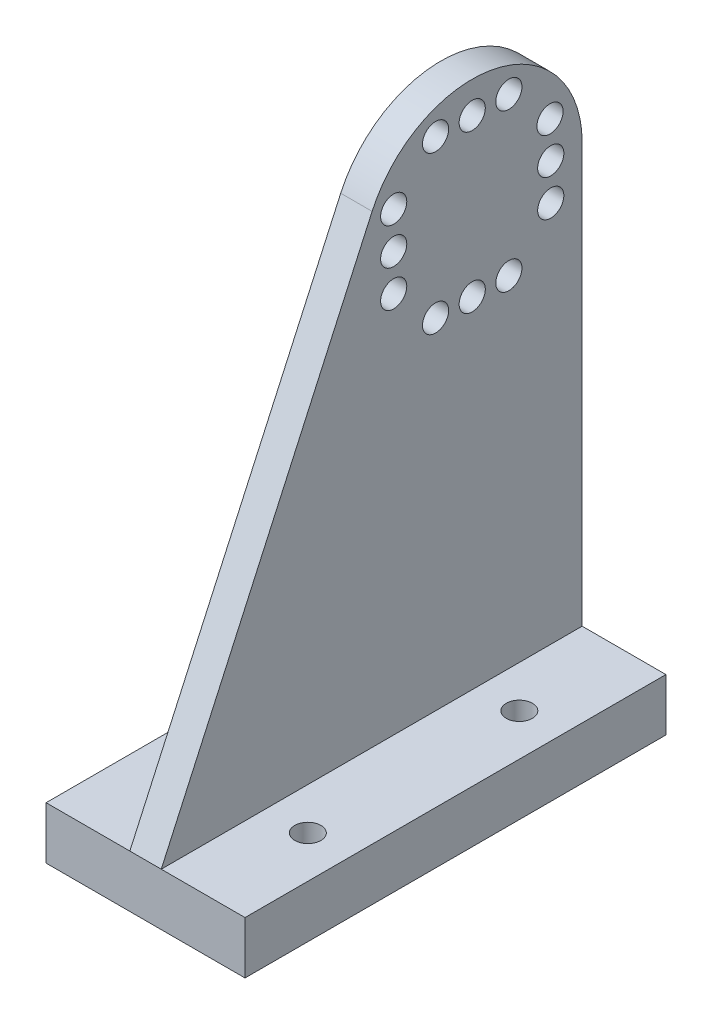
ISO-10303-21;
HEADER;
FILE_DESCRIPTION(('STEP AP214'),'2;1');
FILE_NAME('part.step','',(''),(''),'','','');
FILE_SCHEMA(('AUTOMOTIVE_DESIGN { 1 0 10303 214 1 1 1 1 }'));
ENDSEC;
DATA;
#1=APPLICATION_CONTEXT('core data for automotive mechanical design processes');
#2=APPLICATION_PROTOCOL_DEFINITION('international standard','automotive_design',2000,#1);
#3=PRODUCT_CONTEXT('',#1,'mechanical');
#4=PRODUCT('Part','Part','',(#3));
#5=PRODUCT_RELATED_PRODUCT_CATEGORY('part','',(#4));
#6=PRODUCT_DEFINITION_FORMATION('','',#4);
#7=PRODUCT_DEFINITION_CONTEXT('part definition',#1,'design');
#8=PRODUCT_DEFINITION('design','',#6,#7);
#9=PRODUCT_DEFINITION_SHAPE('','',#8);
#10=(LENGTH_UNIT() NAMED_UNIT(*) SI_UNIT(.MILLI.,.METRE.));
#11=(NAMED_UNIT(*) PLANE_ANGLE_UNIT() SI_UNIT($,.RADIAN.));
#12=(NAMED_UNIT(*) SI_UNIT($,.STERADIAN.) SOLID_ANGLE_UNIT());
#13=UNCERTAINTY_MEASURE_WITH_UNIT(LENGTH_MEASURE(1.E-05),#10,'distance_accuracy_value','');
#14=(GEOMETRIC_REPRESENTATION_CONTEXT(3) GLOBAL_UNCERTAINTY_ASSIGNED_CONTEXT((#13)) GLOBAL_UNIT_ASSIGNED_CONTEXT((#10,
#11,#12)) REPRESENTATION_CONTEXT('',''));
#15=CARTESIAN_POINT('',(0.,0.,0.));
#16=DIRECTION('',(0.,0.,1.));
#17=DIRECTION('',(1.,0.,0.));
#18=AXIS2_PLACEMENT_3D('',#15,#16,#17);
#19=CARTESIAN_POINT('',(0.,0.,0.));
#20=DIRECTION('',(1.,0.,0.));
#21=DIRECTION('',(0.,0.,-1.));
#22=AXIS2_PLACEMENT_3D('',#19,#20,#21);
#23=PLANE('',#22);
#24=CARTESIAN_POINT('',(0.,7.50000000000002,3.50000000000001));
#25=DIRECTION('',(1.,0.,0.));
#26=DIRECTION('',(0.,0.,-1.));
#27=AXIS2_PLACEMENT_3D('',#24,#25,#26);
#28=CIRCLE('',#27,1.25);
#29=CARTESIAN_POINT('',(0.,7.50000000000002,2.25000000000002));
#30=VERTEX_POINT('',#29);
#31=EDGE_CURVE('E122',#30,#30,#28,.T.);
#32=ORIENTED_EDGE('',*,*,#31,.T.);
#33=EDGE_LOOP('',(#32));
#34=FACE_BOUND('',#33,.T.);
#35=CARTESIAN_POINT('',(0.,7.50000000000002,-3.49999999999999));
#36=DIRECTION('',(1.,0.,0.));
#37=DIRECTION('',(0.,0.,-1.));
#38=AXIS2_PLACEMENT_3D('',#35,#36,#37);
#39=CIRCLE('',#38,1.25);
#40=CARTESIAN_POINT('',(0.,7.50000000000002,-4.74999999999998));
#41=VERTEX_POINT('',#40);
#42=EDGE_CURVE('E119',#41,#41,#39,.T.);
#43=ORIENTED_EDGE('',*,*,#42,.T.);
#44=EDGE_LOOP('',(#43));
#45=FACE_BOUND('',#44,.T.);
#46=CARTESIAN_POINT('',(0.,3.49926490451764,-7.42827045231361));
#47=DIRECTION('',(1.,0.,0.));
#48=DIRECTION('',(0.,0.,-1.));
#49=AXIS2_PLACEMENT_3D('',#46,#47,#48);
#50=CIRCLE('',#49,1.25);
#51=CARTESIAN_POINT('',(0.,3.49926490451764,-8.67827045231361));
#52=VERTEX_POINT('',#51);
#53=EDGE_CURVE('E116',#52,#52,#50,.T.);
#54=ORIENTED_EDGE('',*,*,#53,.T.);
#55=EDGE_LOOP('',(#54));
#56=FACE_BOUND('',#55,.T.);
#57=CARTESIAN_POINT('',(0.,-3.49999999999998,-7.49999999999998));
#58=DIRECTION('',(1.,0.,0.));
#59=DIRECTION('',(0.,0.,-1.));
#60=AXIS2_PLACEMENT_3D('',#57,#58,#59);
#61=CIRCLE('',#60,1.25);
#62=CARTESIAN_POINT('',(0.,-3.49999999999998,-8.74999999999999));
#63=VERTEX_POINT('',#62);
#64=EDGE_CURVE('E113',#63,#63,#61,.T.);
#65=ORIENTED_EDGE('',*,*,#64,.T.);
#66=EDGE_LOOP('',(#65));
#67=FACE_BOUND('',#66,.T.);
#68=CARTESIAN_POINT('',(0.,-7.5,-3.5));
#69=DIRECTION('',(1.,0.,0.));
#70=DIRECTION('',(0.,0.,-1.));
#71=AXIS2_PLACEMENT_3D('',#68,#69,#70);
#72=CIRCLE('',#71,1.25);
#73=CARTESIAN_POINT('',(0.,-7.5,-4.75));
#74=VERTEX_POINT('',#73);
#75=EDGE_CURVE('E110',#74,#74,#72,.T.);
#76=ORIENTED_EDGE('',*,*,#75,.T.);
#77=EDGE_LOOP('',(#76));
#78=FACE_BOUND('',#77,.T.);
#79=CARTESIAN_POINT('',(0.,-7.5,3.5));
#80=DIRECTION('',(1.,0.,0.));
#81=DIRECTION('',(0.,0.,-1.));
#82=AXIS2_PLACEMENT_3D('',#79,#80,#81);
#83=CIRCLE('',#82,1.25);
#84=CARTESIAN_POINT('',(0.,-7.5,2.25));
#85=VERTEX_POINT('',#84);
#86=EDGE_CURVE('E107',#85,#85,#83,.T.);
#87=ORIENTED_EDGE('',*,*,#86,.T.);
#88=EDGE_LOOP('',(#87));
#89=FACE_BOUND('',#88,.T.);
#90=CARTESIAN_POINT('',(0.,-3.5,7.50000000000001));
#91=DIRECTION('',(1.,0.,0.));
#92=DIRECTION('',(0.,0.,-1.));
#93=AXIS2_PLACEMENT_3D('',#90,#91,#92);
#94=CIRCLE('',#93,1.25);
#95=CARTESIAN_POINT('',(0.,-3.5,6.25000000000001));
#96=VERTEX_POINT('',#95);
#97=EDGE_CURVE('E104',#96,#96,#94,.T.);
#98=ORIENTED_EDGE('',*,*,#97,.T.);
#99=EDGE_LOOP('',(#98));
#100=FACE_BOUND('',#99,.T.);
#101=CARTESIAN_POINT('',(0.,3.5,7.50000000000002));
#102=DIRECTION('',(1.,0.,0.));
#103=DIRECTION('',(0.,0.,-1.));
#104=AXIS2_PLACEMENT_3D('',#101,#102,#103);
#105=CIRCLE('',#104,1.25);
#106=CARTESIAN_POINT('',(0.,3.5,6.25000000000002));
#107=VERTEX_POINT('',#106);
#108=EDGE_CURVE('E101',#107,#107,#105,.T.);
#109=ORIENTED_EDGE('',*,*,#108,.T.);
#110=EDGE_LOOP('',(#109));
#111=FACE_BOUND('',#110,.T.);
#112=CARTESIAN_POINT('',(0.,0.,7.50000000000002));
#113=DIRECTION('',(1.,0.,0.));
#114=DIRECTION('',(0.,0.,-1.));
#115=AXIS2_PLACEMENT_3D('',#112,#113,#114);
#116=CIRCLE('',#115,1.25);
#117=CARTESIAN_POINT('',(0.,0.,6.25000000000002));
#118=VERTEX_POINT('',#117);
#119=EDGE_CURVE('E98',#118,#118,#116,.T.);
#120=ORIENTED_EDGE('',*,*,#119,.T.);
#121=EDGE_LOOP('',(#120));
#122=FACE_BOUND('',#121,.T.);
#123=CARTESIAN_POINT('',(0.,0.,-7.5));
#124=DIRECTION('',(1.,0.,0.));
#125=DIRECTION('',(0.,0.,-1.));
#126=AXIS2_PLACEMENT_3D('',#123,#124,#125);
#127=CIRCLE('',#126,1.25);
#128=CARTESIAN_POINT('',(0.,0.,-8.75));
#129=VERTEX_POINT('',#128);
#130=EDGE_CURVE('E95',#129,#129,#127,.T.);
#131=ORIENTED_EDGE('',*,*,#130,.T.);
#132=EDGE_LOOP('',(#131));
#133=FACE_BOUND('',#132,.T.);
#134=CARTESIAN_POINT('',(0.,-7.5,0.));
#135=DIRECTION('',(1.,0.,0.));
#136=DIRECTION('',(0.,0.,-1.));
#137=AXIS2_PLACEMENT_3D('',#134,#135,#136);
#138=CIRCLE('',#137,1.25);
#139=CARTESIAN_POINT('',(0.,-7.5,-1.25));
#140=VERTEX_POINT('',#139);
#141=EDGE_CURVE('E89',#140,#140,#138,.T.);
#142=ORIENTED_EDGE('',*,*,#141,.T.);
#143=EDGE_LOOP('',(#142));
#144=FACE_BOUND('',#143,.T.);
#145=CARTESIAN_POINT('',(0.,7.50000000000002,0.));
#146=DIRECTION('',(1.,0.,0.));
#147=DIRECTION('',(0.,0.,-1.));
#148=AXIS2_PLACEMENT_3D('',#145,#146,#147);
#149=CIRCLE('',#148,1.25);
#150=CARTESIAN_POINT('',(0.,7.50000000000002,-1.24999999999999));
#151=VERTEX_POINT('',#150);
#152=EDGE_CURVE('E86',#151,#151,#149,.T.);
#153=ORIENTED_EDGE('',*,*,#152,.T.);
#154=EDGE_LOOP('',(#153));
#155=FACE_BOUND('',#154,.T.);
#156=DIRECTION('',(0.,0.,-1.));
#157=VECTOR('',#156,1.);
#158=CARTESIAN_POINT('',(0.,-40.,-10.5));
#159=LINE('',#158,#157);
#160=CARTESIAN_POINT('',(0.,-40.,29.7));
#161=VERTEX_POINT('',#160);
#162=CARTESIAN_POINT('',(0.,-40.,-10.5));
#163=VERTEX_POINT('',#162);
#164=EDGE_CURVE('E85',#161,#163,#159,.T.);
#165=ORIENTED_EDGE('',*,*,#164,.F.);
#166=DIRECTION('',(0.,0.910487371799059,-0.413536873560801));
#167=VECTOR('',#166,1.);
#168=CARTESIAN_POINT('',(0.,4.34213717238841,9.56011740389012));
#169=LINE('',#168,#167);
#170=CARTESIAN_POINT('',(0.,4.34213717238854,9.56011740389006));
#171=VERTEX_POINT('',#170);
#172=EDGE_CURVE('E71',#161,#171,#169,.T.);
#173=ORIENTED_EDGE('',*,*,#172,.T.);
#174=CARTESIAN_POINT('',(0.,0.,0.));
#175=DIRECTION('',(1.,0.,0.));
#176=DIRECTION('',(0.,0.,-1.));
#177=AXIS2_PLACEMENT_3D('',#174,#175,#176);
#178=CIRCLE('',#177,10.5);
#179=CARTESIAN_POINT('',(0.,0.,-10.5));
#180=VERTEX_POINT('',#179);
#181=EDGE_CURVE('E76',#180,#171,#178,.T.);
#182=ORIENTED_EDGE('',*,*,#181,.F.);
#183=DIRECTION('',(0.,-1.,0.));
#184=VECTOR('',#183,1.);
#185=CARTESIAN_POINT('',(0.,0.,-10.5));
#186=LINE('',#185,#184);
#187=EDGE_CURVE('E82',#180,#163,#186,.T.);
#188=ORIENTED_EDGE('',*,*,#187,.T.);
#189=EDGE_LOOP('',(#165,#173,#182,#188));
#190=FACE_BOUND('',#189,.T.);
#191=ADVANCED_FACE('F34',(#34,#45,#56,#67,#78,#89,#100,#111,#122,#133,#144,#155,#190),#23,.F.);
#192=CARTESIAN_POINT('',(3.,0.,-10.5));
#193=DIRECTION('',(0.,0.,-1.));
#194=DIRECTION('',(-1.,0.,0.));
#195=AXIS2_PLACEMENT_3D('',#192,#193,#194);
#196=PLANE('',#195);
#197=ORIENTED_EDGE('',*,*,#187,.F.);
#198=DIRECTION('',(-1.,0.,0.));
#199=VECTOR('',#198,1.);
#200=CARTESIAN_POINT('',(3.,0.,-10.5));
#201=LINE('',#200,#199);
#202=CARTESIAN_POINT('',(3.,0.,-10.5));
#203=VERTEX_POINT('',#202);
#204=EDGE_CURVE('E11',#203,#180,#201,.T.);
#205=ORIENTED_EDGE('',*,*,#204,.F.);
#206=DIRECTION('',(0.,-1.,0.));
#207=VECTOR('',#206,1.);
#208=CARTESIAN_POINT('',(3.,0.,-10.5));
#209=LINE('',#208,#207);
#210=CARTESIAN_POINT('',(3.,-40.,-10.5));
#211=VERTEX_POINT('',#210);
#212=EDGE_CURVE('E125',#203,#211,#209,.T.);
#213=ORIENTED_EDGE('',*,*,#212,.T.);
#214=DIRECTION('',(-1.,0.,0.));
#215=VECTOR('',#214,1.);
#216=CARTESIAN_POINT('',(11.,-40.,-10.5));
#217=LINE('',#216,#215);
#218=CARTESIAN_POINT('',(11.,-40.,-10.5));
#219=VERTEX_POINT('',#218);
#220=EDGE_CURVE('E273',#219,#211,#217,.T.);
#221=ORIENTED_EDGE('',*,*,#220,.F.);
#222=DIRECTION('',(0.,1.,0.));
#223=VECTOR('',#222,1.);
#224=CARTESIAN_POINT('',(11.,-40.,-10.5));
#225=LINE('',#224,#223);
#226=CARTESIAN_POINT('',(11.,-45.,-10.5));
#227=VERTEX_POINT('',#226);
#228=EDGE_CURVE('E291',#227,#219,#225,.T.);
#229=ORIENTED_EDGE('',*,*,#228,.F.);
#230=DIRECTION('',(1.,0.,0.));
#231=VECTOR('',#230,1.);
#232=CARTESIAN_POINT('',(3.,-45.,-10.5));
#233=LINE('',#232,#231);
#234=CARTESIAN_POINT('',(-8.,-45.,-10.5));
#235=VERTEX_POINT('',#234);
#236=EDGE_CURVE('E140',#235,#227,#233,.T.);
#237=ORIENTED_EDGE('',*,*,#236,.F.);
#238=DIRECTION('',(0.,-1.,0.));
#239=VECTOR('',#238,1.);
#240=CARTESIAN_POINT('',(-8.,-40.,-10.5));
#241=LINE('',#240,#239);
#242=CARTESIAN_POINT('',(-8.,-40.,-10.5));
#243=VERTEX_POINT('',#242);
#244=EDGE_CURVE('E260',#243,#235,#241,.T.);
#245=ORIENTED_EDGE('',*,*,#244,.F.);
#246=DIRECTION('',(1.,0.,0.));
#247=VECTOR('',#246,1.);
#248=CARTESIAN_POINT('',(-8.,-40.,-10.5));
#249=LINE('',#248,#247);
#250=EDGE_CURVE('E257',#243,#163,#249,.T.);
#251=ORIENTED_EDGE('',*,*,#250,.T.);
#252=EDGE_LOOP('',(#197,#205,#213,#221,#229,#237,#245,#251));
#253=FACE_BOUND('',#252,.T.);
#254=ADVANCED_FACE('F36',(#253),#196,.T.);
#255=CARTESIAN_POINT('',(3.,0.,0.));
#256=DIRECTION('',(-1.,0.,0.));
#257=DIRECTION('',(0.,0.,1.));
#258=AXIS2_PLACEMENT_3D('',#255,#256,#257);
#259=CYLINDRICAL_SURFACE('',#258,10.5);
#260=ORIENTED_EDGE('',*,*,#181,.T.);
#261=DIRECTION('',(-1.,0.,0.));
#262=VECTOR('',#261,1.);
#263=CARTESIAN_POINT('',(3.,4.34213717238854,9.56011740389006));
#264=LINE('',#263,#262);
#265=CARTESIAN_POINT('',(3.,4.34213717238854,9.56011740389006));
#266=VERTEX_POINT('',#265);
#267=EDGE_CURVE('E42',#266,#171,#264,.T.);
#268=ORIENTED_EDGE('',*,*,#267,.F.);
#269=CARTESIAN_POINT('',(3.,0.,0.));
#270=DIRECTION('',(1.,0.,0.));
#271=DIRECTION('',(0.,0.,-1.));
#272=AXIS2_PLACEMENT_3D('',#269,#270,#271);
#273=CIRCLE('',#272,10.5);
#274=EDGE_CURVE('E157',#203,#266,#273,.T.);
#275=ORIENTED_EDGE('',*,*,#274,.F.);
#276=ORIENTED_EDGE('',*,*,#204,.T.);
#277=EDGE_LOOP('',(#260,#268,#275,#276));
#278=FACE_BOUND('',#277,.T.);
#279=ADVANCED_FACE('F77',(#278),#259,.T.);
#280=CARTESIAN_POINT('',(3.,4.34213717238841,9.56011740389012));
#281=DIRECTION('',(0.,0.413536873560801,0.910487371799059));
#282=DIRECTION('',(0.,-0.910487371799059,0.413536873560801));
#283=AXIS2_PLACEMENT_3D('',#280,#281,#282);
#284=PLANE('',#283);
#285=ORIENTED_EDGE('',*,*,#172,.F.);
#286=DIRECTION('',(-1.,0.,0.));
#287=VECTOR('',#286,1.);
#288=CARTESIAN_POINT('',(3.,-40.,29.7));
#289=LINE('',#288,#287);
#290=CARTESIAN_POINT('',(3.,-40.,29.7));
#291=VERTEX_POINT('',#290);
#292=EDGE_CURVE('E74',#291,#161,#289,.T.);
#293=ORIENTED_EDGE('',*,*,#292,.F.);
#294=DIRECTION('',(0.,0.910487371799059,-0.413536873560801));
#295=VECTOR('',#294,1.);
#296=CARTESIAN_POINT('',(3.,4.34213717238841,9.56011740389012));
#297=LINE('',#296,#295);
#298=EDGE_CURVE('E57',#291,#266,#297,.T.);
#299=ORIENTED_EDGE('',*,*,#298,.T.);
#300=ORIENTED_EDGE('',*,*,#267,.T.);
#301=EDGE_LOOP('',(#285,#293,#299,#300));
#302=FACE_BOUND('',#301,.T.);
#303=ADVANCED_FACE('F69',(#302),#284,.T.);
#304=CARTESIAN_POINT('',(3.,7.50000000000002,-3.49999999999999));
#305=DIRECTION('',(-1.,0.,0.));
#306=DIRECTION('',(0.,0.,1.));
#307=AXIS2_PLACEMENT_3D('',#304,#305,#306);
#308=CYLINDRICAL_SURFACE('',#307,1.25);
#309=CARTESIAN_POINT('',(3.,7.50000000000002,-3.49999999999999));
#310=DIRECTION('',(1.,0.,0.));
#311=DIRECTION('',(0.,0.,-1.));
#312=AXIS2_PLACEMENT_3D('',#309,#310,#311);
#313=CIRCLE('',#312,1.25);
#314=CARTESIAN_POINT('',(3.,7.50000000000002,-4.74999999999998));
#315=VERTEX_POINT('',#314);
#316=EDGE_CURVE('E132',#315,#315,#313,.T.);
#317=ORIENTED_EDGE('',*,*,#316,.T.);
#318=EDGE_LOOP('',(#317));
#319=FACE_BOUND('',#318,.T.);
#320=ORIENTED_EDGE('',*,*,#42,.F.);
#321=EDGE_LOOP('',(#320));
#322=FACE_BOUND('',#321,.T.);
#323=ADVANCED_FACE('F201',(#319,#322),#308,.F.);
#324=CARTESIAN_POINT('',(3.,3.49926490451764,-7.42827045231361));
#325=DIRECTION('',(-1.,0.,0.));
#326=DIRECTION('',(0.,0.,1.));
#327=AXIS2_PLACEMENT_3D('',#324,#325,#326);
#328=CYLINDRICAL_SURFACE('',#327,1.25);
#329=CARTESIAN_POINT('',(3.,3.49926490451764,-7.42827045231361));
#330=DIRECTION('',(1.,0.,0.));
#331=DIRECTION('',(0.,0.,-1.));
#332=AXIS2_PLACEMENT_3D('',#329,#330,#331);
#333=CIRCLE('',#332,1.25);
#334=CARTESIAN_POINT('',(3.,3.49926490451764,-8.67827045231361));
#335=VERTEX_POINT('',#334);
#336=EDGE_CURVE('E137',#335,#335,#333,.T.);
#337=ORIENTED_EDGE('',*,*,#336,.T.);
#338=EDGE_LOOP('',(#337));
#339=FACE_BOUND('',#338,.T.);
#340=ORIENTED_EDGE('',*,*,#53,.F.);
#341=EDGE_LOOP('',(#340));
#342=FACE_BOUND('',#341,.T.);
#343=ADVANCED_FACE('F189',(#339,#342),#328,.F.);
#344=CARTESIAN_POINT('',(3.,-3.49999999999998,-7.49999999999998));
#345=DIRECTION('',(-1.,0.,0.));
#346=DIRECTION('',(0.,0.,1.));
#347=AXIS2_PLACEMENT_3D('',#344,#345,#346);
#348=CYLINDRICAL_SURFACE('',#347,1.25);
#349=CARTESIAN_POINT('',(3.,-3.49999999999998,-7.49999999999998));
#350=DIRECTION('',(1.,0.,0.));
#351=DIRECTION('',(0.,0.,-1.));
#352=AXIS2_PLACEMENT_3D('',#349,#350,#351);
#353=CIRCLE('',#352,1.25);
#354=CARTESIAN_POINT('',(3.,-3.49999999999998,-8.74999999999999));
#355=VERTEX_POINT('',#354);
#356=EDGE_CURVE('E184',#355,#355,#353,.T.);
#357=ORIENTED_EDGE('',*,*,#356,.T.);
#358=EDGE_LOOP('',(#357));
#359=FACE_BOUND('',#358,.T.);
#360=ORIENTED_EDGE('',*,*,#64,.F.);
#361=EDGE_LOOP('',(#360));
#362=FACE_BOUND('',#361,.T.);
#363=ADVANCED_FACE('F360',(#359,#362),#348,.F.);
#364=CARTESIAN_POINT('',(3.,-7.5,-3.5));
#365=DIRECTION('',(-1.,0.,0.));
#366=DIRECTION('',(0.,0.,1.));
#367=AXIS2_PLACEMENT_3D('',#364,#365,#366);
#368=CYLINDRICAL_SURFACE('',#367,1.25);
#369=CARTESIAN_POINT('',(3.,-7.5,-3.5));
#370=DIRECTION('',(1.,0.,0.));
#371=DIRECTION('',(0.,0.,-1.));
#372=AXIS2_PLACEMENT_3D('',#369,#370,#371);
#373=CIRCLE('',#372,1.25);
#374=CARTESIAN_POINT('',(3.,-7.5,-4.75));
#375=VERTEX_POINT('',#374);
#376=EDGE_CURVE('E181',#375,#375,#373,.T.);
#377=ORIENTED_EDGE('',*,*,#376,.T.);
#378=EDGE_LOOP('',(#377));
#379=FACE_BOUND('',#378,.T.);
#380=ORIENTED_EDGE('',*,*,#75,.F.);
#381=EDGE_LOOP('',(#380));
#382=FACE_BOUND('',#381,.T.);
#383=ADVANCED_FACE('F363',(#379,#382),#368,.F.);
#384=CARTESIAN_POINT('',(3.,-7.5,3.5));
#385=DIRECTION('',(-1.,0.,0.));
#386=DIRECTION('',(0.,0.,1.));
#387=AXIS2_PLACEMENT_3D('',#384,#385,#386);
#388=CYLINDRICAL_SURFACE('',#387,1.25);
#389=CARTESIAN_POINT('',(3.,-7.5,3.5));
#390=DIRECTION('',(1.,0.,0.));
#391=DIRECTION('',(0.,0.,-1.));
#392=AXIS2_PLACEMENT_3D('',#389,#390,#391);
#393=CIRCLE('',#392,1.25);
#394=CARTESIAN_POINT('',(3.,-7.5,2.25));
#395=VERTEX_POINT('',#394);
#396=EDGE_CURVE('E178',#395,#395,#393,.T.);
#397=ORIENTED_EDGE('',*,*,#396,.T.);
#398=EDGE_LOOP('',(#397));
#399=FACE_BOUND('',#398,.T.);
#400=ORIENTED_EDGE('',*,*,#86,.F.);
#401=EDGE_LOOP('',(#400));
#402=FACE_BOUND('',#401,.T.);
#403=ADVANCED_FACE('F367',(#399,#402),#388,.F.);
#404=CARTESIAN_POINT('',(3.,-3.5,7.50000000000001));
#405=DIRECTION('',(-1.,0.,0.));
#406=DIRECTION('',(0.,0.,1.));
#407=AXIS2_PLACEMENT_3D('',#404,#405,#406);
#408=CYLINDRICAL_SURFACE('',#407,1.25);
#409=CARTESIAN_POINT('',(3.,-3.5,7.50000000000001));
#410=DIRECTION('',(1.,0.,0.));
#411=DIRECTION('',(0.,0.,-1.));
#412=AXIS2_PLACEMENT_3D('',#409,#410,#411);
#413=CIRCLE('',#412,1.25);
#414=CARTESIAN_POINT('',(3.,-3.5,6.25000000000001));
#415=VERTEX_POINT('',#414);
#416=EDGE_CURVE('E175',#415,#415,#413,.T.);
#417=ORIENTED_EDGE('',*,*,#416,.T.);
#418=EDGE_LOOP('',(#417));
#419=FACE_BOUND('',#418,.T.);
#420=ORIENTED_EDGE('',*,*,#97,.F.);
#421=EDGE_LOOP('',(#420));
#422=FACE_BOUND('',#421,.T.);
#423=ADVANCED_FACE('F371',(#419,#422),#408,.F.);
#424=CARTESIAN_POINT('',(3.,3.5,7.50000000000002));
#425=DIRECTION('',(-1.,0.,0.));
#426=DIRECTION('',(0.,0.,1.));
#427=AXIS2_PLACEMENT_3D('',#424,#425,#426);
#428=CYLINDRICAL_SURFACE('',#427,1.25);
#429=CARTESIAN_POINT('',(3.,3.5,7.50000000000002));
#430=DIRECTION('',(1.,0.,0.));
#431=DIRECTION('',(0.,0.,-1.));
#432=AXIS2_PLACEMENT_3D('',#429,#430,#431);
#433=CIRCLE('',#432,1.25);
#434=CARTESIAN_POINT('',(3.,3.5,6.25000000000002));
#435=VERTEX_POINT('',#434);
#436=EDGE_CURVE('E172',#435,#435,#433,.T.);
#437=ORIENTED_EDGE('',*,*,#436,.T.);
#438=EDGE_LOOP('',(#437));
#439=FACE_BOUND('',#438,.T.);
#440=ORIENTED_EDGE('',*,*,#108,.F.);
#441=EDGE_LOOP('',(#440));
#442=FACE_BOUND('',#441,.T.);
#443=ADVANCED_FACE('F375',(#439,#442),#428,.F.);
#444=CARTESIAN_POINT('',(3.,0.,7.50000000000002));
#445=DIRECTION('',(-1.,0.,0.));
#446=DIRECTION('',(0.,0.,1.));
#447=AXIS2_PLACEMENT_3D('',#444,#445,#446);
#448=CYLINDRICAL_SURFACE('',#447,1.25);
#449=CARTESIAN_POINT('',(3.,0.,7.50000000000002));
#450=DIRECTION('',(1.,0.,0.));
#451=DIRECTION('',(0.,0.,-1.));
#452=AXIS2_PLACEMENT_3D('',#449,#450,#451);
#453=CIRCLE('',#452,1.25);
#454=CARTESIAN_POINT('',(3.,0.,6.25000000000002));
#455=VERTEX_POINT('',#454);
#456=EDGE_CURVE('E169',#455,#455,#453,.T.);
#457=ORIENTED_EDGE('',*,*,#456,.T.);
#458=EDGE_LOOP('',(#457));
#459=FACE_BOUND('',#458,.T.);
#460=ORIENTED_EDGE('',*,*,#119,.F.);
#461=EDGE_LOOP('',(#460));
#462=FACE_BOUND('',#461,.T.);
#463=ADVANCED_FACE('F379',(#459,#462),#448,.F.);
#464=CARTESIAN_POINT('',(3.,0.,-7.5));
#465=DIRECTION('',(-1.,0.,0.));
#466=DIRECTION('',(0.,0.,1.));
#467=AXIS2_PLACEMENT_3D('',#464,#465,#466);
#468=CYLINDRICAL_SURFACE('',#467,1.25);
#469=CARTESIAN_POINT('',(3.,0.,-7.5));
#470=DIRECTION('',(1.,0.,0.));
#471=DIRECTION('',(0.,0.,-1.));
#472=AXIS2_PLACEMENT_3D('',#469,#470,#471);
#473=CIRCLE('',#472,1.25);
#474=CARTESIAN_POINT('',(3.,0.,-8.75));
#475=VERTEX_POINT('',#474);
#476=EDGE_CURVE('E166',#475,#475,#473,.T.);
#477=ORIENTED_EDGE('',*,*,#476,.T.);
#478=EDGE_LOOP('',(#477));
#479=FACE_BOUND('',#478,.T.);
#480=ORIENTED_EDGE('',*,*,#130,.F.);
#481=EDGE_LOOP('',(#480));
#482=FACE_BOUND('',#481,.T.);
#483=ADVANCED_FACE('F241',(#479,#482),#468,.F.);
#484=CARTESIAN_POINT('',(3.,-7.5,0.));
#485=DIRECTION('',(-1.,0.,0.));
#486=DIRECTION('',(0.,0.,1.));
#487=AXIS2_PLACEMENT_3D('',#484,#485,#486);
#488=CYLINDRICAL_SURFACE('',#487,1.25);
#489=CARTESIAN_POINT('',(3.,-7.5,0.));
#490=DIRECTION('',(1.,0.,0.));
#491=DIRECTION('',(0.,0.,-1.));
#492=AXIS2_PLACEMENT_3D('',#489,#490,#491);
#493=CIRCLE('',#492,1.25);
#494=CARTESIAN_POINT('',(3.,-7.5,-1.25));
#495=VERTEX_POINT('',#494);
#496=EDGE_CURVE('E163',#495,#495,#493,.T.);
#497=ORIENTED_EDGE('',*,*,#496,.T.);
#498=EDGE_LOOP('',(#497));
#499=FACE_BOUND('',#498,.T.);
#500=ORIENTED_EDGE('',*,*,#141,.F.);
#501=EDGE_LOOP('',(#500));
#502=FACE_BOUND('',#501,.T.);
#503=ADVANCED_FACE('F233',(#499,#502),#488,.F.);
#504=CARTESIAN_POINT('',(3.,7.50000000000002,0.));
#505=DIRECTION('',(-1.,0.,0.));
#506=DIRECTION('',(0.,0.,1.));
#507=AXIS2_PLACEMENT_3D('',#504,#505,#506);
#508=CYLINDRICAL_SURFACE('',#507,1.25);
#509=CARTESIAN_POINT('',(3.,7.50000000000002,0.));
#510=DIRECTION('',(1.,0.,0.));
#511=DIRECTION('',(0.,0.,-1.));
#512=AXIS2_PLACEMENT_3D('',#509,#510,#511);
#513=CIRCLE('',#512,1.25);
#514=CARTESIAN_POINT('',(3.,7.50000000000002,-1.24999999999999));
#515=VERTEX_POINT('',#514);
#516=EDGE_CURVE('E160',#515,#515,#513,.T.);
#517=ORIENTED_EDGE('',*,*,#516,.T.);
#518=EDGE_LOOP('',(#517));
#519=FACE_BOUND('',#518,.T.);
#520=ORIENTED_EDGE('',*,*,#152,.F.);
#521=EDGE_LOOP('',(#520));
#522=FACE_BOUND('',#521,.T.);
#523=ADVANCED_FACE('F231',(#519,#522),#508,.F.);
#524=CARTESIAN_POINT('',(3.,7.50000000000002,3.50000000000001));
#525=DIRECTION('',(-1.,0.,0.));
#526=DIRECTION('',(0.,0.,1.));
#527=AXIS2_PLACEMENT_3D('',#524,#525,#526);
#528=CYLINDRICAL_SURFACE('',#527,1.25);
#529=CARTESIAN_POINT('',(3.,7.50000000000002,3.50000000000001));
#530=DIRECTION('',(1.,0.,0.));
#531=DIRECTION('',(0.,0.,-1.));
#532=AXIS2_PLACEMENT_3D('',#529,#530,#531);
#533=CIRCLE('',#532,1.25);
#534=CARTESIAN_POINT('',(3.,7.50000000000002,2.25000000000002));
#535=VERTEX_POINT('',#534);
#536=EDGE_CURVE('E127',#535,#535,#533,.T.);
#537=ORIENTED_EDGE('',*,*,#536,.T.);
#538=EDGE_LOOP('',(#537));
#539=FACE_BOUND('',#538,.T.);
#540=ORIENTED_EDGE('',*,*,#31,.F.);
#541=EDGE_LOOP('',(#540));
#542=FACE_BOUND('',#541,.T.);
#543=ADVANCED_FACE('F196',(#539,#542),#528,.F.);
#544=CARTESIAN_POINT('',(3.,0.,0.));
#545=DIRECTION('',(1.,0.,0.));
#546=DIRECTION('',(0.,0.,-1.));
#547=AXIS2_PLACEMENT_3D('',#544,#545,#546);
#548=PLANE('',#547);
#549=DIRECTION('',(0.,0.,1.));
#550=VECTOR('',#549,1.);
#551=CARTESIAN_POINT('',(3.,-40.,29.7));
#552=LINE('',#551,#550);
#553=EDGE_CURVE('E49',#211,#291,#552,.T.);
#554=ORIENTED_EDGE('',*,*,#553,.F.);
#555=ORIENTED_EDGE('',*,*,#212,.F.);
#556=ORIENTED_EDGE('',*,*,#274,.T.);
#557=ORIENTED_EDGE('',*,*,#298,.F.);
#558=EDGE_LOOP('',(#554,#555,#556,#557));
#559=FACE_BOUND('',#558,.T.);
#560=ORIENTED_EDGE('',*,*,#516,.F.);
#561=EDGE_LOOP('',(#560));
#562=FACE_BOUND('',#561,.T.);
#563=ORIENTED_EDGE('',*,*,#496,.F.);
#564=EDGE_LOOP('',(#563));
#565=FACE_BOUND('',#564,.T.);
#566=ORIENTED_EDGE('',*,*,#476,.F.);
#567=EDGE_LOOP('',(#566));
#568=FACE_BOUND('',#567,.T.);
#569=ORIENTED_EDGE('',*,*,#456,.F.);
#570=EDGE_LOOP('',(#569));
#571=FACE_BOUND('',#570,.T.);
#572=ORIENTED_EDGE('',*,*,#436,.F.);
#573=EDGE_LOOP('',(#572));
#574=FACE_BOUND('',#573,.T.);
#575=ORIENTED_EDGE('',*,*,#416,.F.);
#576=EDGE_LOOP('',(#575));
#577=FACE_BOUND('',#576,.T.);
#578=ORIENTED_EDGE('',*,*,#396,.F.);
#579=EDGE_LOOP('',(#578));
#580=FACE_BOUND('',#579,.T.);
#581=ORIENTED_EDGE('',*,*,#376,.F.);
#582=EDGE_LOOP('',(#581));
#583=FACE_BOUND('',#582,.T.);
#584=ORIENTED_EDGE('',*,*,#356,.F.);
#585=EDGE_LOOP('',(#584));
#586=FACE_BOUND('',#585,.T.);
#587=ORIENTED_EDGE('',*,*,#336,.F.);
#588=EDGE_LOOP('',(#587));
#589=FACE_BOUND('',#588,.T.);
#590=ORIENTED_EDGE('',*,*,#316,.F.);
#591=EDGE_LOOP('',(#590));
#592=FACE_BOUND('',#591,.T.);
#593=ORIENTED_EDGE('',*,*,#536,.F.);
#594=EDGE_LOOP('',(#593));
#595=FACE_BOUND('',#594,.T.);
#596=ADVANCED_FACE('F192',(#559,#562,#565,#568,#571,#574,#577,#580,#583,#586,#589,#592,#595),
#548,.T.);
#597=CARTESIAN_POINT('',(3.,-45.,29.7));
#598=DIRECTION('',(0.,0.,-1.));
#599=DIRECTION('',(-1.,0.,0.));
#600=AXIS2_PLACEMENT_3D('',#597,#598,#599);
#601=PLANE('',#600);
#602=ORIENTED_EDGE('',*,*,#292,.T.);
#603=DIRECTION('',(1.,0.,0.));
#604=VECTOR('',#603,1.);
#605=CARTESIAN_POINT('',(-8.,-40.,29.7));
#606=LINE('',#605,#604);
#607=CARTESIAN_POINT('',(-8.,-40.,29.7));
#608=VERTEX_POINT('',#607);
#609=EDGE_CURVE('E152',#608,#161,#606,.T.);
#610=ORIENTED_EDGE('',*,*,#609,.F.);
#611=DIRECTION('',(0.,1.,0.));
#612=VECTOR('',#611,1.);
#613=CARTESIAN_POINT('',(-8.,-40.,29.7));
#614=LINE('',#613,#612);
#615=CARTESIAN_POINT('',(-8.,-45.,29.7));
#616=VERTEX_POINT('',#615);
#617=EDGE_CURVE('E270',#616,#608,#614,.T.);
#618=ORIENTED_EDGE('',*,*,#617,.F.);
#619=DIRECTION('',(-1.,0.,0.));
#620=VECTOR('',#619,1.);
#621=CARTESIAN_POINT('',(3.,-45.,29.7));
#622=LINE('',#621,#620);
#623=CARTESIAN_POINT('',(11.,-45.,29.7));
#624=VERTEX_POINT('',#623);
#625=EDGE_CURVE('E143',#624,#616,#622,.T.);
#626=ORIENTED_EDGE('',*,*,#625,.F.);
#627=DIRECTION('',(0.,-1.,0.));
#628=VECTOR('',#627,1.);
#629=CARTESIAN_POINT('',(11.,-40.,29.7));
#630=LINE('',#629,#628);
#631=CARTESIAN_POINT('',(11.,-40.,29.7));
#632=VERTEX_POINT('',#631);
#633=EDGE_CURVE('E287',#632,#624,#630,.T.);
#634=ORIENTED_EDGE('',*,*,#633,.F.);
#635=DIRECTION('',(-1.,0.,0.));
#636=VECTOR('',#635,1.);
#637=CARTESIAN_POINT('',(11.,-40.,29.7));
#638=LINE('',#637,#636);
#639=EDGE_CURVE('E283',#632,#291,#638,.T.);
#640=ORIENTED_EDGE('',*,*,#639,.T.);
#641=EDGE_LOOP('',(#602,#610,#618,#626,#634,#640));
#642=FACE_BOUND('',#641,.T.);
#643=ADVANCED_FACE('F195',(#642),#601,.F.);
#644=CARTESIAN_POINT('',(0.,-45.,0.));
#645=DIRECTION('',(0.,-1.,0.));
#646=DIRECTION('',(0.,0.,-1.));
#647=AXIS2_PLACEMENT_3D('',#644,#645,#646);
#648=PLANE('',#647);
#649=CARTESIAN_POINT('',(7.,-45.,19.7));
#650=DIRECTION('',(0.,-1.,0.));
#651=DIRECTION('',(0.,0.,-1.));
#652=AXIS2_PLACEMENT_3D('',#649,#650,#651);
#653=CIRCLE('',#652,1.25);
#654=CARTESIAN_POINT('',(7.,-45.,18.45));
#655=VERTEX_POINT('',#654);
#656=EDGE_CURVE('E303',#655,#655,#653,.T.);
#657=ORIENTED_EDGE('',*,*,#656,.F.);
#658=EDGE_LOOP('',(#657));
#659=FACE_BOUND('',#658,.T.);
#660=CARTESIAN_POINT('',(7.,-45.,-0.5));
#661=DIRECTION('',(0.,-1.,0.));
#662=DIRECTION('',(0.,0.,-1.));
#663=AXIS2_PLACEMENT_3D('',#660,#661,#662);
#664=CIRCLE('',#663,1.25);
#665=CARTESIAN_POINT('',(7.,-45.,-1.75));
#666=VERTEX_POINT('',#665);
#667=EDGE_CURVE('E288',#666,#666,#664,.T.);
#668=ORIENTED_EDGE('',*,*,#667,.F.);
#669=EDGE_LOOP('',(#668));
#670=FACE_BOUND('',#669,.T.);
#671=ORIENTED_EDGE('',*,*,#236,.T.);
#672=DIRECTION('',(0.,0.,-1.));
#673=VECTOR('',#672,1.);
#674=CARTESIAN_POINT('',(11.,-45.,29.7));
#675=LINE('',#674,#673);
#676=EDGE_CURVE('E294',#624,#227,#675,.T.);
#677=ORIENTED_EDGE('',*,*,#676,.F.);
#678=ORIENTED_EDGE('',*,*,#625,.T.);
#679=DIRECTION('',(0.,0.,1.));
#680=VECTOR('',#679,1.);
#681=CARTESIAN_POINT('',(-8.,-45.,-10.5));
#682=LINE('',#681,#680);
#683=EDGE_CURVE('E277',#235,#616,#682,.T.);
#684=ORIENTED_EDGE('',*,*,#683,.F.);
#685=EDGE_LOOP('',(#671,#677,#678,#684));
#686=FACE_BOUND('',#685,.T.);
#687=ADVANCED_FACE('F344',(#659,#670,#686),#648,.T.);
#688=CARTESIAN_POINT('',(-8.,-40.,-10.5));
#689=DIRECTION('',(0.,-1.,0.));
#690=DIRECTION('',(0.,0.,-1.));
#691=AXIS2_PLACEMENT_3D('',#688,#689,#690);
#692=PLANE('',#691);
#693=ORIENTED_EDGE('',*,*,#164,.T.);
#694=ORIENTED_EDGE('',*,*,#250,.F.);
#695=DIRECTION('',(0.,0.,-1.));
#696=VECTOR('',#695,1.);
#697=CARTESIAN_POINT('',(-8.,-40.,-10.5));
#698=LINE('',#697,#696);
#699=EDGE_CURVE('E266',#608,#243,#698,.T.);
#700=ORIENTED_EDGE('',*,*,#699,.F.);
#701=ORIENTED_EDGE('',*,*,#609,.T.);
#702=EDGE_LOOP('',(#693,#694,#700,#701));
#703=FACE_BOUND('',#702,.T.);
#704=ADVANCED_FACE('F342',(#703),#692,.F.);
#705=CARTESIAN_POINT('',(-8.,0.,0.));
#706=DIRECTION('',(-1.,0.,0.));
#707=DIRECTION('',(0.,0.,1.));
#708=AXIS2_PLACEMENT_3D('',#705,#706,#707);
#709=PLANE('',#708);
#710=ORIENTED_EDGE('',*,*,#244,.T.);
#711=ORIENTED_EDGE('',*,*,#683,.T.);
#712=ORIENTED_EDGE('',*,*,#617,.T.);
#713=ORIENTED_EDGE('',*,*,#699,.T.);
#714=EDGE_LOOP('',(#710,#711,#712,#713));
#715=FACE_BOUND('',#714,.T.);
#716=ADVANCED_FACE('F316',(#715),#709,.T.);
#717=CARTESIAN_POINT('',(11.,-40.,29.7));
#718=DIRECTION('',(0.,-1.,0.));
#719=DIRECTION('',(0.,0.,-1.));
#720=AXIS2_PLACEMENT_3D('',#717,#718,#719);
#721=PLANE('',#720);
#722=CARTESIAN_POINT('',(7.,-40.,19.7));
#723=DIRECTION('',(0.,1.,0.));
#724=DIRECTION('',(0.,0.,1.));
#725=AXIS2_PLACEMENT_3D('',#722,#723,#724);
#726=CIRCLE('',#725,1.25);
#727=CARTESIAN_POINT('',(7.,-40.,20.95));
#728=VERTEX_POINT('',#727);
#729=EDGE_CURVE('E306',#728,#728,#726,.T.);
#730=ORIENTED_EDGE('',*,*,#729,.F.);
#731=EDGE_LOOP('',(#730));
#732=FACE_BOUND('',#731,.T.);
#733=CARTESIAN_POINT('',(7.,-40.,-0.5));
#734=DIRECTION('',(0.,1.,0.));
#735=DIRECTION('',(0.,0.,1.));
#736=AXIS2_PLACEMENT_3D('',#733,#734,#735);
#737=CIRCLE('',#736,1.25);
#738=CARTESIAN_POINT('',(7.,-40.,0.749999999999999));
#739=VERTEX_POINT('',#738);
#740=EDGE_CURVE('E300',#739,#739,#737,.T.);
#741=ORIENTED_EDGE('',*,*,#740,.F.);
#742=EDGE_LOOP('',(#741));
#743=FACE_BOUND('',#742,.T.);
#744=ORIENTED_EDGE('',*,*,#553,.T.);
#745=ORIENTED_EDGE('',*,*,#639,.F.);
#746=DIRECTION('',(0.,0.,1.));
#747=VECTOR('',#746,1.);
#748=CARTESIAN_POINT('',(11.,-40.,29.7));
#749=LINE('',#748,#747);
#750=EDGE_CURVE('E285',#219,#632,#749,.T.);
#751=ORIENTED_EDGE('',*,*,#750,.F.);
#752=ORIENTED_EDGE('',*,*,#220,.T.);
#753=EDGE_LOOP('',(#744,#745,#751,#752));
#754=FACE_BOUND('',#753,.T.);
#755=ADVANCED_FACE('F312',(#732,#743,#754),#721,.F.);
#756=CARTESIAN_POINT('',(11.,0.,0.));
#757=DIRECTION('',(1.,0.,0.));
#758=DIRECTION('',(0.,0.,-1.));
#759=AXIS2_PLACEMENT_3D('',#756,#757,#758);
#760=PLANE('',#759);
#761=ORIENTED_EDGE('',*,*,#633,.T.);
#762=ORIENTED_EDGE('',*,*,#676,.T.);
#763=ORIENTED_EDGE('',*,*,#228,.T.);
#764=ORIENTED_EDGE('',*,*,#750,.T.);
#765=EDGE_LOOP('',(#761,#762,#763,#764));
#766=FACE_BOUND('',#765,.T.);
#767=ADVANCED_FACE('F315',(#766),#760,.T.);
#768=CARTESIAN_POINT('',(7.,-48.,-0.5));
#769=DIRECTION('',(0.,1.,0.));
#770=DIRECTION('',(0.,0.,1.));
#771=AXIS2_PLACEMENT_3D('',#768,#769,#770);
#772=CYLINDRICAL_SURFACE('',#771,1.25);
#773=ORIENTED_EDGE('',*,*,#667,.T.);
#774=EDGE_LOOP('',(#773));
#775=FACE_BOUND('',#774,.T.);
#776=ORIENTED_EDGE('',*,*,#740,.T.);
#777=EDGE_LOOP('',(#776));
#778=FACE_BOUND('',#777,.T.);
#779=ADVANCED_FACE('F468',(#775,#778),#772,.F.);
#780=CARTESIAN_POINT('',(7.,-48.,19.7));
#781=DIRECTION('',(0.,1.,0.));
#782=DIRECTION('',(0.,0.,1.));
#783=AXIS2_PLACEMENT_3D('',#780,#781,#782);
#784=CYLINDRICAL_SURFACE('',#783,1.25);
#785=ORIENTED_EDGE('',*,*,#656,.T.);
#786=EDGE_LOOP('',(#785));
#787=FACE_BOUND('',#786,.T.);
#788=ORIENTED_EDGE('',*,*,#729,.T.);
#789=EDGE_LOOP('',(#788));
#790=FACE_BOUND('',#789,.T.);
#791=ADVANCED_FACE('F310',(#787,#790),#784,.F.);
#792=CLOSED_SHELL('',(#191,#254,#279,#303,#323,#343,#363,#383,#403,#423,#443,#463,#483,#503,
#523,#543,#596,#643,#687,#704,#716,#755,#767,#779,#791));
#793=MANIFOLD_SOLID_BREP('B2',#792);
#794=ADVANCED_BREP_SHAPE_REPRESENTATION('',(#18,#793),#14);
#795=SHAPE_DEFINITION_REPRESENTATION(#9,#794);
ENDSEC;
END-ISO-10303-21;
